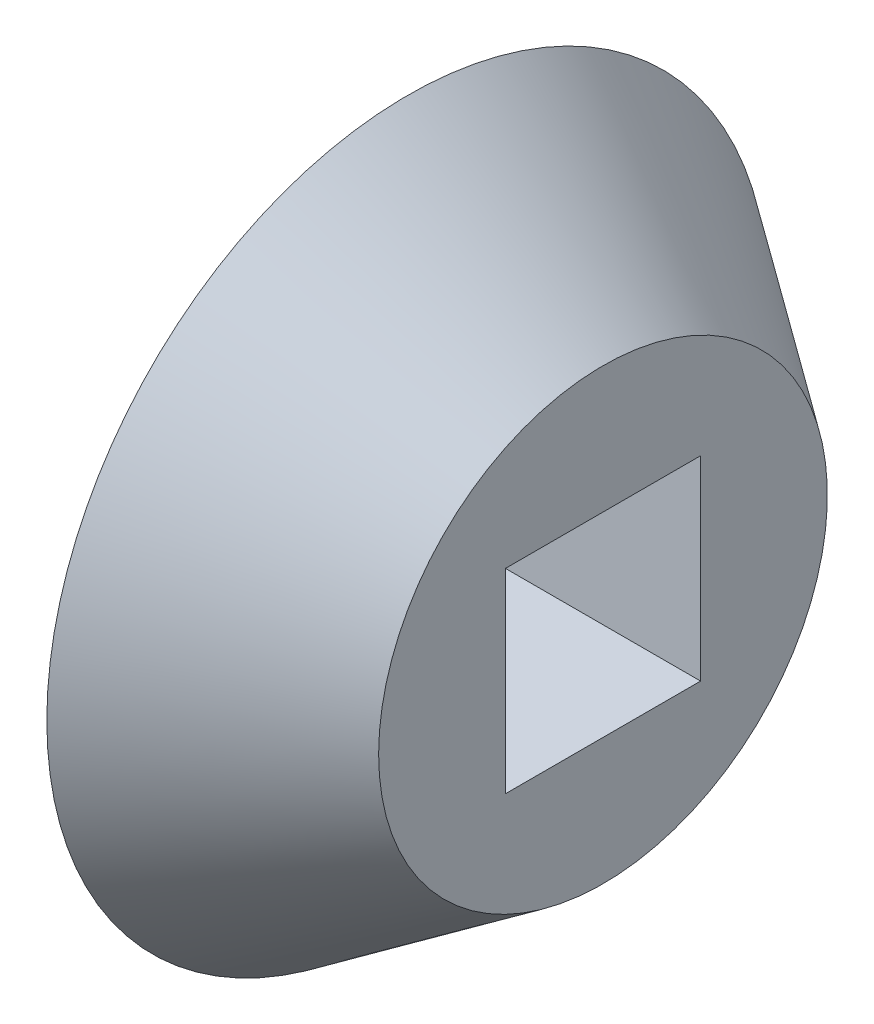
ISO-10303-21;
HEADER;
FILE_DESCRIPTION(('STEP AP214'),'2;1');
FILE_NAME('part.step','',(''),(''),'','','');
FILE_SCHEMA(('AUTOMOTIVE_DESIGN { 1 0 10303 214 1 1 1 1 }'));
ENDSEC;
DATA;
#1=APPLICATION_CONTEXT('core data for automotive mechanical design processes');
#2=APPLICATION_PROTOCOL_DEFINITION('international standard','automotive_design',2000,#1);
#3=PRODUCT_CONTEXT('',#1,'mechanical');
#4=PRODUCT('Part','Part','',(#3));
#5=PRODUCT_RELATED_PRODUCT_CATEGORY('part','',(#4));
#6=PRODUCT_DEFINITION_FORMATION('','',#4);
#7=PRODUCT_DEFINITION_CONTEXT('part definition',#1,'design');
#8=PRODUCT_DEFINITION('design','',#6,#7);
#9=PRODUCT_DEFINITION_SHAPE('','',#8);
#10=(LENGTH_UNIT() NAMED_UNIT(*) SI_UNIT(.MILLI.,.METRE.));
#11=(NAMED_UNIT(*) PLANE_ANGLE_UNIT() SI_UNIT($,.RADIAN.));
#12=(NAMED_UNIT(*) SI_UNIT($,.STERADIAN.) SOLID_ANGLE_UNIT());
#13=UNCERTAINTY_MEASURE_WITH_UNIT(LENGTH_MEASURE(1.E-05),#10,'distance_accuracy_value','');
#14=(GEOMETRIC_REPRESENTATION_CONTEXT(3) GLOBAL_UNCERTAINTY_ASSIGNED_CONTEXT((#13)) GLOBAL_UNIT_ASSIGNED_CONTEXT((#10,
#11,#12)) REPRESENTATION_CONTEXT('',''));
#15=CARTESIAN_POINT('',(0.,0.,0.));
#16=DIRECTION('',(0.,0.,1.));
#17=DIRECTION('',(1.,0.,0.));
#18=AXIS2_PLACEMENT_3D('',#15,#16,#17);
#19=CARTESIAN_POINT('',(3.175,0.,0.));
#20=DIRECTION('',(1.,0.,0.));
#21=DIRECTION('',(0.,0.,-1.));
#22=AXIS2_PLACEMENT_3D('',#19,#20,#21);
#23=PLANE('',#22);
#24=DIRECTION('',(0.,0.,-1.));
#25=VECTOR('',#24,1.);
#26=CARTESIAN_POINT('',(3.175,-1.5875,-1.5875));
#27=LINE('',#26,#25);
#28=CARTESIAN_POINT('',(3.175,-1.5875,1.5875));
#29=VERTEX_POINT('',#28);
#30=CARTESIAN_POINT('',(3.175,-1.5875,-1.5875));
#31=VERTEX_POINT('',#30);
#32=EDGE_CURVE('E82',#29,#31,#27,.T.);
#33=ORIENTED_EDGE('',*,*,#32,.F.);
#34=DIRECTION('',(0.,-1.,0.));
#35=VECTOR('',#34,1.);
#36=CARTESIAN_POINT('',(3.175,-1.5875,1.5875));
#37=LINE('',#36,#35);
#38=CARTESIAN_POINT('',(3.175,1.5875,1.5875));
#39=VERTEX_POINT('',#38);
#40=EDGE_CURVE('E75',#39,#29,#37,.T.);
#41=ORIENTED_EDGE('',*,*,#40,.F.);
#42=DIRECTION('',(0.,0.,1.));
#43=VECTOR('',#42,1.);
#44=CARTESIAN_POINT('',(3.175,1.5875,-1.5875));
#45=LINE('',#44,#43);
#46=CARTESIAN_POINT('',(3.175,1.5875,-1.5875));
#47=VERTEX_POINT('',#46);
#48=EDGE_CURVE('E94',#47,#39,#45,.T.);
#49=ORIENTED_EDGE('',*,*,#48,.F.);
#50=DIRECTION('',(0.,1.,0.));
#51=VECTOR('',#50,1.);
#52=CARTESIAN_POINT('',(3.175,-1.5875,-1.5875));
#53=LINE('',#52,#51);
#54=EDGE_CURVE('E92',#31,#47,#53,.T.);
#55=ORIENTED_EDGE('',*,*,#54,.F.);
#56=EDGE_LOOP('',(#33,#41,#49,#55));
#57=FACE_BOUND('',#56,.T.);
#58=CARTESIAN_POINT('',(3.175,0.,0.));
#59=DIRECTION('',(-1.,0.,0.));
#60=DIRECTION('',(0.,0.,1.));
#61=AXIS2_PLACEMENT_3D('',#58,#59,#60);
#62=CIRCLE('',#61,3.6505910661842);
#63=CARTESIAN_POINT('',(3.175,0.,3.6505910661842));
#64=VERTEX_POINT('',#63);
#65=EDGE_CURVE('E100',#64,#64,#62,.T.);
#66=ORIENTED_EDGE('',*,*,#65,.F.);
#67=EDGE_LOOP('',(#66));
#68=FACE_BOUND('',#67,.T.);
#69=ADVANCED_FACE('F35',(#57,#68),#23,.T.);
#70=CARTESIAN_POINT('',(0.,0.,0.));
#71=DIRECTION('',(1.,0.,0.));
#72=DIRECTION('',(0.,0.,-1.));
#73=AXIS2_PLACEMENT_3D('',#70,#71,#72);
#74=PLANE('',#73);
#75=CARTESIAN_POINT('',(0.,0.,0.));
#76=DIRECTION('',(-1.,0.,0.));
#77=DIRECTION('',(0.,0.,1.));
#78=AXIS2_PLACEMENT_3D('',#75,#76,#77);
#79=CIRCLE('',#78,5.87375);
#80=CARTESIAN_POINT('',(0.,0.,5.87375));
#81=VERTEX_POINT('',#80);
#82=EDGE_CURVE('E172',#81,#81,#79,.T.);
#83=ORIENTED_EDGE('',*,*,#82,.T.);
#84=EDGE_LOOP('',(#83));
#85=FACE_BOUND('',#84,.T.);
#86=DIRECTION('',(0.,-1.,0.));
#87=VECTOR('',#86,1.);
#88=CARTESIAN_POINT('',(0.,-1.5875,1.5875));
#89=LINE('',#88,#87);
#90=CARTESIAN_POINT('',(0.,1.5875,1.5875));
#91=VERTEX_POINT('',#90);
#92=CARTESIAN_POINT('',(0.,-1.5875,1.5875));
#93=VERTEX_POINT('',#92);
#94=EDGE_CURVE('E57',#91,#93,#89,.T.);
#95=ORIENTED_EDGE('',*,*,#94,.T.);
#96=DIRECTION('',(0.,0.,-1.));
#97=VECTOR('',#96,1.);
#98=CARTESIAN_POINT('',(0.,-1.5875,-1.5875));
#99=LINE('',#98,#97);
#100=CARTESIAN_POINT('',(0.,-1.5875,-1.5875));
#101=VERTEX_POINT('',#100);
#102=EDGE_CURVE('E89',#93,#101,#99,.T.);
#103=ORIENTED_EDGE('',*,*,#102,.T.);
#104=DIRECTION('',(0.,1.,0.));
#105=VECTOR('',#104,1.);
#106=CARTESIAN_POINT('',(0.,-1.5875,-1.5875));
#107=LINE('',#106,#105);
#108=CARTESIAN_POINT('',(0.,1.5875,-1.5875));
#109=VERTEX_POINT('',#108);
#110=EDGE_CURVE('E102',#101,#109,#107,.T.);
#111=ORIENTED_EDGE('',*,*,#110,.T.);
#112=DIRECTION('',(0.,0.,1.));
#113=VECTOR('',#112,1.);
#114=CARTESIAN_POINT('',(0.,1.5875,-1.5875));
#115=LINE('',#114,#113);
#116=EDGE_CURVE('E83',#109,#91,#115,.T.);
#117=ORIENTED_EDGE('',*,*,#116,.T.);
#118=EDGE_LOOP('',(#95,#103,#111,#117));
#119=FACE_BOUND('',#118,.T.);
#120=ADVANCED_FACE('F37',(#85,#119),#74,.F.);
#121=CARTESIAN_POINT('',(3.175,-1.5875,1.5875));
#122=DIRECTION('',(0.,0.,-1.));
#123=DIRECTION('',(-1.,0.,0.));
#124=AXIS2_PLACEMENT_3D('',#121,#122,#123);
#125=PLANE('',#124);
#126=ORIENTED_EDGE('',*,*,#94,.F.);
#127=DIRECTION('',(-1.,0.,0.));
#128=VECTOR('',#127,1.);
#129=CARTESIAN_POINT('',(3.175,1.5875,1.5875));
#130=LINE('',#129,#128);
#131=EDGE_CURVE('E78',#39,#91,#130,.T.);
#132=ORIENTED_EDGE('',*,*,#131,.F.);
#133=ORIENTED_EDGE('',*,*,#40,.T.);
#134=DIRECTION('',(-1.,0.,0.));
#135=VECTOR('',#134,1.);
#136=CARTESIAN_POINT('',(3.175,-1.5875,1.5875));
#137=LINE('',#136,#135);
#138=EDGE_CURVE('E11',#29,#93,#137,.T.);
#139=ORIENTED_EDGE('',*,*,#138,.T.);
#140=EDGE_LOOP('',(#126,#132,#133,#139));
#141=FACE_BOUND('',#140,.T.);
#142=ADVANCED_FACE('F77',(#141),#125,.T.);
#143=CARTESIAN_POINT('',(3.175,-1.5875,-1.5875));
#144=DIRECTION('',(0.,1.,0.));
#145=DIRECTION('',(0.,0.,1.));
#146=AXIS2_PLACEMENT_3D('',#143,#144,#145);
#147=PLANE('',#146);
#148=ORIENTED_EDGE('',*,*,#102,.F.);
#149=ORIENTED_EDGE('',*,*,#138,.F.);
#150=ORIENTED_EDGE('',*,*,#32,.T.);
#151=DIRECTION('',(-1.,0.,0.));
#152=VECTOR('',#151,1.);
#153=CARTESIAN_POINT('',(3.175,-1.5875,-1.5875));
#154=LINE('',#153,#152);
#155=EDGE_CURVE('E43',#31,#101,#154,.T.);
#156=ORIENTED_EDGE('',*,*,#155,.T.);
#157=EDGE_LOOP('',(#148,#149,#150,#156));
#158=FACE_BOUND('',#157,.T.);
#159=ADVANCED_FACE('F86',(#158),#147,.T.);
#160=CARTESIAN_POINT('',(3.175,-1.5875,-1.5875));
#161=DIRECTION('',(0.,0.,1.));
#162=DIRECTION('',(1.,0.,0.));
#163=AXIS2_PLACEMENT_3D('',#160,#161,#162);
#164=PLANE('',#163);
#165=ORIENTED_EDGE('',*,*,#110,.F.);
#166=ORIENTED_EDGE('',*,*,#155,.F.);
#167=ORIENTED_EDGE('',*,*,#54,.T.);
#168=DIRECTION('',(-1.,0.,0.));
#169=VECTOR('',#168,1.);
#170=CARTESIAN_POINT('',(3.175,1.5875,-1.5875));
#171=LINE('',#170,#169);
#172=EDGE_CURVE('E50',#47,#109,#171,.T.);
#173=ORIENTED_EDGE('',*,*,#172,.T.);
#174=EDGE_LOOP('',(#165,#166,#167,#173));
#175=FACE_BOUND('',#174,.T.);
#176=ADVANCED_FACE('F110',(#175),#164,.T.);
#177=CARTESIAN_POINT('',(3.175,1.5875,-1.5875));
#178=DIRECTION('',(0.,-1.,0.));
#179=DIRECTION('',(0.,0.,-1.));
#180=AXIS2_PLACEMENT_3D('',#177,#178,#179);
#181=PLANE('',#180);
#182=ORIENTED_EDGE('',*,*,#116,.F.);
#183=ORIENTED_EDGE('',*,*,#172,.F.);
#184=ORIENTED_EDGE('',*,*,#48,.T.);
#185=ORIENTED_EDGE('',*,*,#131,.T.);
#186=EDGE_LOOP('',(#182,#183,#184,#185));
#187=FACE_BOUND('',#186,.T.);
#188=ADVANCED_FACE('F112',(#187),#181,.T.);
#189=CARTESIAN_POINT('',(0.,0.,0.));
#190=DIRECTION('',(-1.,0.,0.));
#191=DIRECTION('',(0.,0.,1.));
#192=AXIS2_PLACEMENT_3D('',#189,#190,#191);
#193=CONICAL_SURFACE('',#192,5.87375,0.61086523819801);
#194=ORIENTED_EDGE('',*,*,#65,.T.);
#195=EDGE_LOOP('',(#194));
#196=FACE_BOUND('',#195,.T.);
#197=ORIENTED_EDGE('',*,*,#82,.F.);
#198=EDGE_LOOP('',(#197));
#199=FACE_BOUND('',#198,.T.);
#200=ADVANCED_FACE('F114',(#196,#199),#193,.T.);
#201=CLOSED_SHELL('',(#69,#120,#142,#159,#176,#188,#200));
#202=MANIFOLD_SOLID_BREP('B2',#201);
#203=ADVANCED_BREP_SHAPE_REPRESENTATION('',(#18,#202),#14);
#204=SHAPE_DEFINITION_REPRESENTATION(#9,#203);
ENDSEC;
END-ISO-10303-21;
